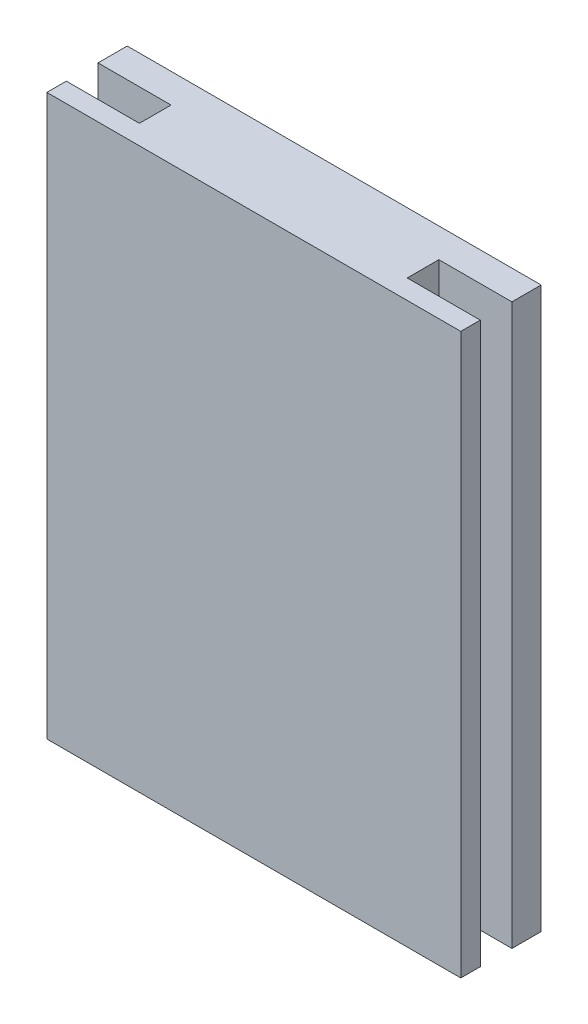
ISO-10303-21;
HEADER;
FILE_DESCRIPTION(('STEP AP214'),'2;1');
FILE_NAME('part.step','',(''),(''),'','','');
FILE_SCHEMA(('AUTOMOTIVE_DESIGN { 1 0 10303 214 1 1 1 1 }'));
ENDSEC;
DATA;
#1=APPLICATION_CONTEXT('core data for automotive mechanical design processes');
#2=APPLICATION_PROTOCOL_DEFINITION('international standard','automotive_design',2000,#1);
#3=PRODUCT_CONTEXT('',#1,'mechanical');
#4=PRODUCT('Part','Part','',(#3));
#5=PRODUCT_RELATED_PRODUCT_CATEGORY('part','',(#4));
#6=PRODUCT_DEFINITION_FORMATION('','',#4);
#7=PRODUCT_DEFINITION_CONTEXT('part definition',#1,'design');
#8=PRODUCT_DEFINITION('design','',#6,#7);
#9=PRODUCT_DEFINITION_SHAPE('','',#8);
#10=(LENGTH_UNIT() NAMED_UNIT(*) SI_UNIT(.MILLI.,.METRE.));
#11=(NAMED_UNIT(*) PLANE_ANGLE_UNIT() SI_UNIT($,.RADIAN.));
#12=(NAMED_UNIT(*) SI_UNIT($,.STERADIAN.) SOLID_ANGLE_UNIT());
#13=UNCERTAINTY_MEASURE_WITH_UNIT(LENGTH_MEASURE(1.E-05),#10,'distance_accuracy_value','');
#14=(GEOMETRIC_REPRESENTATION_CONTEXT(3) GLOBAL_UNCERTAINTY_ASSIGNED_CONTEXT((#13)) GLOBAL_UNIT_ASSIGNED_CONTEXT((#10,
#11,#12)) REPRESENTATION_CONTEXT('',''));
#15=CARTESIAN_POINT('',(0.,0.,0.));
#16=DIRECTION('',(0.,0.,1.));
#17=DIRECTION('',(1.,0.,0.));
#18=AXIS2_PLACEMENT_3D('',#15,#16,#17);
#19=CARTESIAN_POINT('',(0.,0.,15.));
#20=DIRECTION('',(0.,1.,0.));
#21=DIRECTION('',(0.,0.,1.));
#22=AXIS2_PLACEMENT_3D('',#19,#20,#21);
#23=PLANE('',#22);
#24=DIRECTION('',(-1.,0.,0.));
#25=VECTOR('',#24,1.);
#26=CARTESIAN_POINT('',(0.,0.,4.5));
#27=LINE('',#26,#25);
#28=CARTESIAN_POINT('',(85.,0.,4.5));
#29=VERTEX_POINT('',#28);
#30=CARTESIAN_POINT('',(0.,0.,4.5));
#31=VERTEX_POINT('',#30);
#32=EDGE_CURVE('E125',#29,#31,#27,.T.);
#33=ORIENTED_EDGE('',*,*,#32,.F.);
#34=DIRECTION('',(0.,0.,-1.));
#35=VECTOR('',#34,1.);
#36=CARTESIAN_POINT('',(85.,0.,15.));
#37=LINE('',#36,#35);
#38=CARTESIAN_POINT('',(85.,0.,10.5));
#39=VERTEX_POINT('',#38);
#40=EDGE_CURVE('E55',#39,#29,#37,.T.);
#41=ORIENTED_EDGE('',*,*,#40,.F.);
#42=DIRECTION('',(1.,0.,0.));
#43=VECTOR('',#42,1.);
#44=CARTESIAN_POINT('',(85.,0.,10.5));
#45=LINE('',#44,#43);
#46=CARTESIAN_POINT('',(70.,0.,10.5));
#47=VERTEX_POINT('',#46);
#48=EDGE_CURVE('E191',#47,#39,#45,.T.);
#49=ORIENTED_EDGE('',*,*,#48,.F.);
#50=DIRECTION('',(0.,0.,-1.));
#51=VECTOR('',#50,1.);
#52=CARTESIAN_POINT('',(70.,0.,15.));
#53=LINE('',#52,#51);
#54=CARTESIAN_POINT('',(70.,0.,17.));
#55=VERTEX_POINT('',#54);
#56=EDGE_CURVE('E190',#55,#47,#53,.T.);
#57=ORIENTED_EDGE('',*,*,#56,.F.);
#58=DIRECTION('',(1.,0.,0.));
#59=VECTOR('',#58,1.);
#60=CARTESIAN_POINT('',(0.,0.,17.));
#61=LINE('',#60,#59);
#62=CARTESIAN_POINT('',(85.,0.,17.));
#63=VERTEX_POINT('',#62);
#64=EDGE_CURVE('E236',#55,#63,#61,.T.);
#65=ORIENTED_EDGE('',*,*,#64,.T.);
#66=DIRECTION('',(0.,0.,-1.));
#67=VECTOR('',#66,1.);
#68=CARTESIAN_POINT('',(85.,0.,21.));
#69=LINE('',#68,#67);
#70=CARTESIAN_POINT('',(85.,0.,21.));
#71=VERTEX_POINT('',#70);
#72=EDGE_CURVE('E218',#71,#63,#69,.T.);
#73=ORIENTED_EDGE('',*,*,#72,.F.);
#74=DIRECTION('',(1.,0.,0.));
#75=VECTOR('',#74,1.);
#76=CARTESIAN_POINT('',(0.,0.,21.));
#77=LINE('',#76,#75);
#78=CARTESIAN_POINT('',(0.,0.,21.));
#79=VERTEX_POINT('',#78);
#80=EDGE_CURVE('E245',#79,#71,#77,.T.);
#81=ORIENTED_EDGE('',*,*,#80,.F.);
#82=DIRECTION('',(0.,0.,-1.));
#83=VECTOR('',#82,1.);
#84=CARTESIAN_POINT('',(0.,0.,21.));
#85=LINE('',#84,#83);
#86=CARTESIAN_POINT('',(0.,0.,17.));
#87=VERTEX_POINT('',#86);
#88=EDGE_CURVE('E216',#79,#87,#85,.T.);
#89=ORIENTED_EDGE('',*,*,#88,.T.);
#90=CARTESIAN_POINT('',(15.,0.,17.));
#91=VERTEX_POINT('',#90);
#92=EDGE_CURVE('E185',#87,#91,#61,.T.);
#93=ORIENTED_EDGE('',*,*,#92,.T.);
#94=DIRECTION('',(0.,0.,-1.));
#95=VECTOR('',#94,1.);
#96=CARTESIAN_POINT('',(15.,0.,15.));
#97=LINE('',#96,#95);
#98=CARTESIAN_POINT('',(15.,0.,10.5));
#99=VERTEX_POINT('',#98);
#100=EDGE_CURVE('E89',#91,#99,#97,.T.);
#101=ORIENTED_EDGE('',*,*,#100,.T.);
#102=DIRECTION('',(-1.,0.,0.));
#103=VECTOR('',#102,1.);
#104=CARTESIAN_POINT('',(0.,0.,10.5));
#105=LINE('',#104,#103);
#106=CARTESIAN_POINT('',(0.,0.,10.5));
#107=VERTEX_POINT('',#106);
#108=EDGE_CURVE('E148',#99,#107,#105,.T.);
#109=ORIENTED_EDGE('',*,*,#108,.T.);
#110=DIRECTION('',(0.,0.,-1.));
#111=VECTOR('',#110,1.);
#112=CARTESIAN_POINT('',(0.,0.,15.));
#113=LINE('',#112,#111);
#114=EDGE_CURVE('E12',#107,#31,#113,.T.);
#115=ORIENTED_EDGE('',*,*,#114,.T.);
#116=EDGE_LOOP('',(#33,#41,#49,#57,#65,#73,#81,#89,#93,#101,#109,#115));
#117=FACE_BOUND('',#116,.T.);
#118=ADVANCED_FACE('F45',(#117),#23,.F.);
#119=CARTESIAN_POINT('',(0.,115.,15.));
#120=DIRECTION('',(0.,-1.,0.));
#121=DIRECTION('',(0.,0.,-1.));
#122=AXIS2_PLACEMENT_3D('',#119,#120,#121);
#123=PLANE('',#122);
#124=DIRECTION('',(0.,0.,-1.));
#125=VECTOR('',#124,1.);
#126=CARTESIAN_POINT('',(85.,115.,15.));
#127=LINE('',#126,#125);
#128=CARTESIAN_POINT('',(85.,115.,10.5));
#129=VERTEX_POINT('',#128);
#130=CARTESIAN_POINT('',(85.,115.,4.5));
#131=VERTEX_POINT('',#130);
#132=EDGE_CURVE('E101',#129,#131,#127,.T.);
#133=ORIENTED_EDGE('',*,*,#132,.T.);
#134=DIRECTION('',(-1.,0.,0.));
#135=VECTOR('',#134,1.);
#136=CARTESIAN_POINT('',(0.,115.,4.5));
#137=LINE('',#136,#135);
#138=CARTESIAN_POINT('',(0.,115.,4.5));
#139=VERTEX_POINT('',#138);
#140=EDGE_CURVE('E62',#131,#139,#137,.T.);
#141=ORIENTED_EDGE('',*,*,#140,.T.);
#142=DIRECTION('',(0.,0.,-1.));
#143=VECTOR('',#142,1.);
#144=CARTESIAN_POINT('',(0.,115.,15.));
#145=LINE('',#144,#143);
#146=CARTESIAN_POINT('',(0.,115.,10.5));
#147=VERTEX_POINT('',#146);
#148=EDGE_CURVE('E97',#147,#139,#145,.T.);
#149=ORIENTED_EDGE('',*,*,#148,.F.);
#150=DIRECTION('',(-1.,0.,0.));
#151=VECTOR('',#150,1.);
#152=CARTESIAN_POINT('',(0.,115.,10.5));
#153=LINE('',#152,#151);
#154=CARTESIAN_POINT('',(15.,115.,10.5));
#155=VERTEX_POINT('',#154);
#156=EDGE_CURVE('E82',#155,#147,#153,.T.);
#157=ORIENTED_EDGE('',*,*,#156,.F.);
#158=DIRECTION('',(0.,0.,-1.));
#159=VECTOR('',#158,1.);
#160=CARTESIAN_POINT('',(15.,115.,15.));
#161=LINE('',#160,#159);
#162=CARTESIAN_POINT('',(15.,115.,17.));
#163=VERTEX_POINT('',#162);
#164=EDGE_CURVE('E90',#163,#155,#161,.T.);
#165=ORIENTED_EDGE('',*,*,#164,.F.);
#166=DIRECTION('',(-1.,0.,0.));
#167=VECTOR('',#166,1.);
#168=CARTESIAN_POINT('',(0.,115.,17.));
#169=LINE('',#168,#167);
#170=CARTESIAN_POINT('',(0.,115.,17.));
#171=VERTEX_POINT('',#170);
#172=EDGE_CURVE('E164',#163,#171,#169,.T.);
#173=ORIENTED_EDGE('',*,*,#172,.T.);
#174=DIRECTION('',(0.,0.,-1.));
#175=VECTOR('',#174,1.);
#176=CARTESIAN_POINT('',(0.,115.,21.));
#177=LINE('',#176,#175);
#178=CARTESIAN_POINT('',(0.,115.,21.));
#179=VERTEX_POINT('',#178);
#180=EDGE_CURVE('E226',#179,#171,#177,.T.);
#181=ORIENTED_EDGE('',*,*,#180,.F.);
#182=DIRECTION('',(-1.,0.,0.));
#183=VECTOR('',#182,1.);
#184=CARTESIAN_POINT('',(0.,115.,21.));
#185=LINE('',#184,#183);
#186=CARTESIAN_POINT('',(85.,115.,21.));
#187=VERTEX_POINT('',#186);
#188=EDGE_CURVE('E228',#187,#179,#185,.T.);
#189=ORIENTED_EDGE('',*,*,#188,.F.);
#190=DIRECTION('',(0.,0.,-1.));
#191=VECTOR('',#190,1.);
#192=CARTESIAN_POINT('',(85.,115.,21.));
#193=LINE('',#192,#191);
#194=CARTESIAN_POINT('',(85.,115.,17.));
#195=VERTEX_POINT('',#194);
#196=EDGE_CURVE('E223',#187,#195,#193,.T.);
#197=ORIENTED_EDGE('',*,*,#196,.T.);
#198=CARTESIAN_POINT('',(70.,115.,17.));
#199=VERTEX_POINT('',#198);
#200=EDGE_CURVE('E229',#195,#199,#169,.T.);
#201=ORIENTED_EDGE('',*,*,#200,.T.);
#202=DIRECTION('',(0.,0.,-1.));
#203=VECTOR('',#202,1.);
#204=CARTESIAN_POINT('',(70.,115.,15.));
#205=LINE('',#204,#203);
#206=CARTESIAN_POINT('',(70.,115.,10.5));
#207=VERTEX_POINT('',#206);
#208=EDGE_CURVE('E192',#199,#207,#205,.T.);
#209=ORIENTED_EDGE('',*,*,#208,.T.);
#210=DIRECTION('',(1.,0.,0.));
#211=VECTOR('',#210,1.);
#212=CARTESIAN_POINT('',(85.,115.,10.5));
#213=LINE('',#212,#211);
#214=EDGE_CURVE('E198',#207,#129,#213,.T.);
#215=ORIENTED_EDGE('',*,*,#214,.T.);
#216=EDGE_LOOP('',(#133,#141,#149,#157,#165,#173,#181,#189,#197,#201,#209,#215));
#217=FACE_BOUND('',#216,.T.);
#218=ADVANCED_FACE('F100',(#217),#123,.F.);
#219=CARTESIAN_POINT('',(85.,0.,15.));
#220=DIRECTION('',(-1.,0.,0.));
#221=DIRECTION('',(0.,0.,1.));
#222=AXIS2_PLACEMENT_3D('',#219,#220,#221);
#223=PLANE('',#222);
#224=DIRECTION('',(0.,1.,0.));
#225=VECTOR('',#224,1.);
#226=CARTESIAN_POINT('',(85.,0.,10.5));
#227=LINE('',#226,#225);
#228=EDGE_CURVE('E117',#39,#129,#227,.T.);
#229=ORIENTED_EDGE('',*,*,#228,.F.);
#230=ORIENTED_EDGE('',*,*,#40,.T.);
#231=DIRECTION('',(0.,1.,0.));
#232=VECTOR('',#231,1.);
#233=CARTESIAN_POINT('',(85.,0.,4.5));
#234=LINE('',#233,#232);
#235=EDGE_CURVE('E114',#29,#131,#234,.T.);
#236=ORIENTED_EDGE('',*,*,#235,.T.);
#237=ORIENTED_EDGE('',*,*,#132,.F.);
#238=EDGE_LOOP('',(#229,#230,#236,#237));
#239=FACE_BOUND('',#238,.T.);
#240=ADVANCED_FACE('F112',(#239),#223,.F.);
#241=CARTESIAN_POINT('',(0.,0.,15.));
#242=DIRECTION('',(1.,0.,0.));
#243=DIRECTION('',(0.,0.,-1.));
#244=AXIS2_PLACEMENT_3D('',#241,#242,#243);
#245=PLANE('',#244);
#246=DIRECTION('',(0.,1.,0.));
#247=VECTOR('',#246,1.);
#248=CARTESIAN_POINT('',(0.,0.,4.5));
#249=LINE('',#248,#247);
#250=EDGE_CURVE('E135',#31,#139,#249,.T.);
#251=ORIENTED_EDGE('',*,*,#250,.F.);
#252=ORIENTED_EDGE('',*,*,#114,.F.);
#253=DIRECTION('',(0.,1.,0.));
#254=VECTOR('',#253,1.);
#255=CARTESIAN_POINT('',(0.,0.,10.5));
#256=LINE('',#255,#254);
#257=EDGE_CURVE('E71',#107,#147,#256,.T.);
#258=ORIENTED_EDGE('',*,*,#257,.T.);
#259=ORIENTED_EDGE('',*,*,#148,.T.);
#260=EDGE_LOOP('',(#251,#252,#258,#259));
#261=FACE_BOUND('',#260,.T.);
#262=ADVANCED_FACE('F47',(#261),#245,.F.);
#263=CARTESIAN_POINT('',(0.,0.,10.5));
#264=DIRECTION('',(0.,0.,-1.));
#265=DIRECTION('',(-1.,0.,0.));
#266=AXIS2_PLACEMENT_3D('',#263,#264,#265);
#267=PLANE('',#266);
#268=ORIENTED_EDGE('',*,*,#156,.T.);
#269=ORIENTED_EDGE('',*,*,#257,.F.);
#270=ORIENTED_EDGE('',*,*,#108,.F.);
#271=DIRECTION('',(0.,1.,0.));
#272=VECTOR('',#271,1.);
#273=CARTESIAN_POINT('',(15.,0.,10.5));
#274=LINE('',#273,#272);
#275=EDGE_CURVE('E84',#99,#155,#274,.T.);
#276=ORIENTED_EDGE('',*,*,#275,.T.);
#277=EDGE_LOOP('',(#268,#269,#270,#276));
#278=FACE_BOUND('',#277,.T.);
#279=ADVANCED_FACE('F83',(#278),#267,.F.);
#280=CARTESIAN_POINT('',(15.,0.,15.));
#281=DIRECTION('',(1.,0.,0.));
#282=DIRECTION('',(0.,0.,-1.));
#283=AXIS2_PLACEMENT_3D('',#280,#281,#282);
#284=PLANE('',#283);
#285=ORIENTED_EDGE('',*,*,#164,.T.);
#286=ORIENTED_EDGE('',*,*,#275,.F.);
#287=ORIENTED_EDGE('',*,*,#100,.F.);
#288=DIRECTION('',(0.,-1.,0.));
#289=VECTOR('',#288,1.);
#290=CARTESIAN_POINT('',(15.,115.,17.));
#291=LINE('',#290,#289);
#292=EDGE_CURVE('E159',#163,#91,#291,.T.);
#293=ORIENTED_EDGE('',*,*,#292,.F.);
#294=EDGE_LOOP('',(#285,#286,#287,#293));
#295=FACE_BOUND('',#294,.T.);
#296=ADVANCED_FACE('F155',(#295),#284,.F.);
#297=CARTESIAN_POINT('',(0.,0.,4.5));
#298=DIRECTION('',(0.,0.,-1.));
#299=DIRECTION('',(-1.,0.,0.));
#300=AXIS2_PLACEMENT_3D('',#297,#298,#299);
#301=PLANE('',#300);
#302=ORIENTED_EDGE('',*,*,#140,.F.);
#303=ORIENTED_EDGE('',*,*,#235,.F.);
#304=ORIENTED_EDGE('',*,*,#32,.T.);
#305=ORIENTED_EDGE('',*,*,#250,.T.);
#306=EDGE_LOOP('',(#302,#303,#304,#305));
#307=FACE_BOUND('',#306,.T.);
#308=ADVANCED_FACE('F124',(#307),#301,.T.);
#309=CARTESIAN_POINT('',(70.,0.,15.));
#310=DIRECTION('',(1.,0.,0.));
#311=DIRECTION('',(0.,0.,-1.));
#312=AXIS2_PLACEMENT_3D('',#309,#310,#311);
#313=PLANE('',#312);
#314=ORIENTED_EDGE('',*,*,#208,.F.);
#315=DIRECTION('',(0.,1.,0.));
#316=VECTOR('',#315,1.);
#317=CARTESIAN_POINT('',(70.,115.,17.));
#318=LINE('',#317,#316);
#319=EDGE_CURVE('E202',#55,#199,#318,.T.);
#320=ORIENTED_EDGE('',*,*,#319,.F.);
#321=ORIENTED_EDGE('',*,*,#56,.T.);
#322=DIRECTION('',(0.,1.,0.));
#323=VECTOR('',#322,1.);
#324=CARTESIAN_POINT('',(70.,0.,10.5));
#325=LINE('',#324,#323);
#326=EDGE_CURVE('E126',#47,#207,#325,.T.);
#327=ORIENTED_EDGE('',*,*,#326,.T.);
#328=EDGE_LOOP('',(#314,#320,#321,#327));
#329=FACE_BOUND('',#328,.T.);
#330=ADVANCED_FACE('F293',(#329),#313,.T.);
#331=CARTESIAN_POINT('',(85.,0.,10.5));
#332=DIRECTION('',(0.,0.,1.));
#333=DIRECTION('',(1.,0.,0.));
#334=AXIS2_PLACEMENT_3D('',#331,#332,#333);
#335=PLANE('',#334);
#336=ORIENTED_EDGE('',*,*,#214,.F.);
#337=ORIENTED_EDGE('',*,*,#326,.F.);
#338=ORIENTED_EDGE('',*,*,#48,.T.);
#339=ORIENTED_EDGE('',*,*,#228,.T.);
#340=EDGE_LOOP('',(#336,#337,#338,#339));
#341=FACE_BOUND('',#340,.T.);
#342=ADVANCED_FACE('F286',(#341),#335,.T.);
#343=CARTESIAN_POINT('',(0.,0.,17.));
#344=DIRECTION('',(0.,0.,1.));
#345=DIRECTION('',(1.,0.,0.));
#346=AXIS2_PLACEMENT_3D('',#343,#344,#345);
#347=PLANE('',#346);
#348=ORIENTED_EDGE('',*,*,#172,.F.);
#349=ORIENTED_EDGE('',*,*,#292,.T.);
#350=ORIENTED_EDGE('',*,*,#92,.F.);
#351=DIRECTION('',(0.,-1.,0.));
#352=VECTOR('',#351,1.);
#353=CARTESIAN_POINT('',(0.,115.,17.));
#354=LINE('',#353,#352);
#355=EDGE_CURVE('E237',#171,#87,#354,.T.);
#356=ORIENTED_EDGE('',*,*,#355,.F.);
#357=EDGE_LOOP('',(#348,#349,#350,#356));
#358=FACE_BOUND('',#357,.T.);
#359=ADVANCED_FACE('F283',(#358),#347,.F.);
#360=ORIENTED_EDGE('',*,*,#64,.F.);
#361=ORIENTED_EDGE('',*,*,#319,.T.);
#362=ORIENTED_EDGE('',*,*,#200,.F.);
#363=DIRECTION('',(0.,1.,0.));
#364=VECTOR('',#363,1.);
#365=CARTESIAN_POINT('',(85.,115.,17.));
#366=LINE('',#365,#364);
#367=EDGE_CURVE('E232',#63,#195,#366,.T.);
#368=ORIENTED_EDGE('',*,*,#367,.F.);
#369=EDGE_LOOP('',(#360,#361,#362,#368));
#370=FACE_BOUND('',#369,.T.);
#371=ADVANCED_FACE('F285',(#370),#347,.F.);
#372=CARTESIAN_POINT('',(0.,115.,21.));
#373=DIRECTION('',(1.,0.,0.));
#374=DIRECTION('',(0.,0.,-1.));
#375=AXIS2_PLACEMENT_3D('',#372,#373,#374);
#376=PLANE('',#375);
#377=ORIENTED_EDGE('',*,*,#355,.T.);
#378=ORIENTED_EDGE('',*,*,#88,.F.);
#379=DIRECTION('',(0.,-1.,0.));
#380=VECTOR('',#379,1.);
#381=CARTESIAN_POINT('',(0.,115.,21.));
#382=LINE('',#381,#380);
#383=EDGE_CURVE('E231',#179,#79,#382,.T.);
#384=ORIENTED_EDGE('',*,*,#383,.F.);
#385=ORIENTED_EDGE('',*,*,#180,.T.);
#386=EDGE_LOOP('',(#377,#378,#384,#385));
#387=FACE_BOUND('',#386,.T.);
#388=ADVANCED_FACE('F261',(#387),#376,.F.);
#389=CARTESIAN_POINT('',(85.,115.,21.));
#390=DIRECTION('',(-1.,0.,0.));
#391=DIRECTION('',(0.,0.,1.));
#392=AXIS2_PLACEMENT_3D('',#389,#390,#391);
#393=PLANE('',#392);
#394=ORIENTED_EDGE('',*,*,#367,.T.);
#395=ORIENTED_EDGE('',*,*,#196,.F.);
#396=DIRECTION('',(0.,1.,0.));
#397=VECTOR('',#396,1.);
#398=CARTESIAN_POINT('',(85.,115.,21.));
#399=LINE('',#398,#397);
#400=EDGE_CURVE('E242',#71,#187,#399,.T.);
#401=ORIENTED_EDGE('',*,*,#400,.F.);
#402=ORIENTED_EDGE('',*,*,#72,.T.);
#403=EDGE_LOOP('',(#394,#395,#401,#402));
#404=FACE_BOUND('',#403,.T.);
#405=ADVANCED_FACE('F281',(#404),#393,.F.);
#406=CARTESIAN_POINT('',(0.,0.,21.));
#407=DIRECTION('',(0.,0.,1.));
#408=DIRECTION('',(1.,0.,0.));
#409=AXIS2_PLACEMENT_3D('',#406,#407,#408);
#410=PLANE('',#409);
#411=ORIENTED_EDGE('',*,*,#383,.T.);
#412=ORIENTED_EDGE('',*,*,#80,.T.);
#413=ORIENTED_EDGE('',*,*,#400,.T.);
#414=ORIENTED_EDGE('',*,*,#188,.T.);
#415=EDGE_LOOP('',(#411,#412,#413,#414));
#416=FACE_BOUND('',#415,.T.);
#417=ADVANCED_FACE('F253',(#416),#410,.T.);
#418=CLOSED_SHELL('',(#118,#218,#240,#262,#279,#296,#308,#330,#342,#359,#371,#388,#405,#417));
#419=MANIFOLD_SOLID_BREP('B2',#418);
#420=ADVANCED_BREP_SHAPE_REPRESENTATION('',(#18,#419),#14);
#421=SHAPE_DEFINITION_REPRESENTATION(#9,#420);
ENDSEC;
END-ISO-10303-21;
